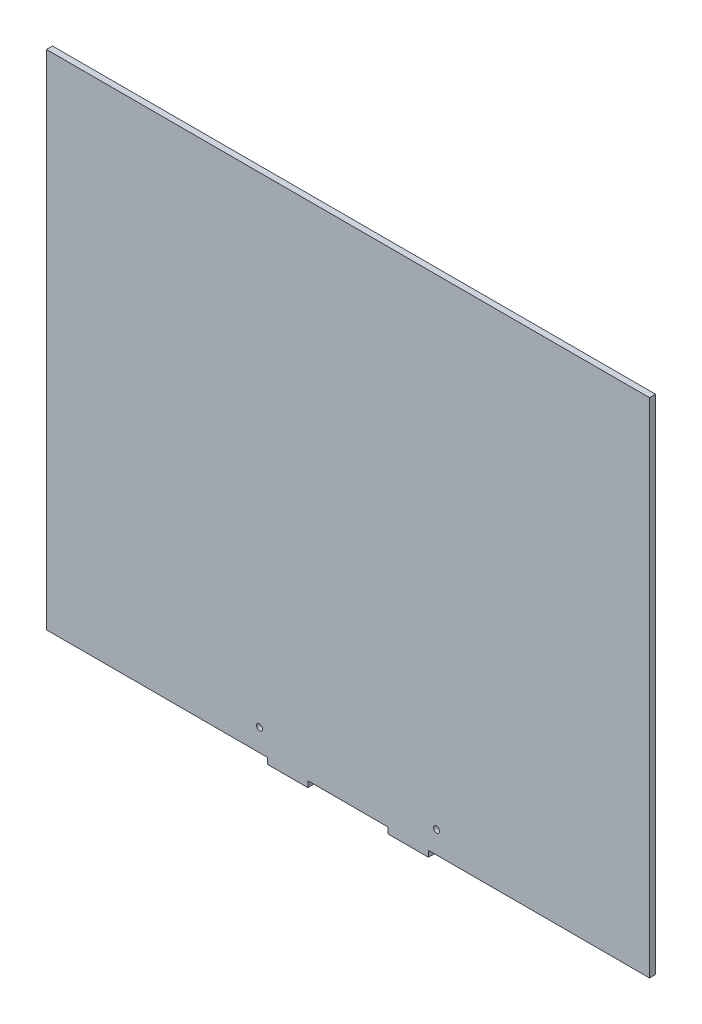
ISO-10303-21;
HEADER;
FILE_DESCRIPTION(('STEP AP214'),'2;1');
FILE_NAME('part.step','',(''),(''),'','','');
FILE_SCHEMA(('AUTOMOTIVE_DESIGN { 1 0 10303 214 1 1 1 1 }'));
ENDSEC;
DATA;
#1=APPLICATION_CONTEXT('core data for automotive mechanical design processes');
#2=APPLICATION_PROTOCOL_DEFINITION('international standard','automotive_design',2000,#1);
#3=PRODUCT_CONTEXT('',#1,'mechanical');
#4=PRODUCT('Part','Part','',(#3));
#5=PRODUCT_RELATED_PRODUCT_CATEGORY('part','',(#4));
#6=PRODUCT_DEFINITION_FORMATION('','',#4);
#7=PRODUCT_DEFINITION_CONTEXT('part definition',#1,'design');
#8=PRODUCT_DEFINITION('design','',#6,#7);
#9=PRODUCT_DEFINITION_SHAPE('','',#8);
#10=(LENGTH_UNIT() NAMED_UNIT(*) SI_UNIT(.MILLI.,.METRE.));
#11=(NAMED_UNIT(*) PLANE_ANGLE_UNIT() SI_UNIT($,.RADIAN.));
#12=(NAMED_UNIT(*) SI_UNIT($,.STERADIAN.) SOLID_ANGLE_UNIT());
#13=UNCERTAINTY_MEASURE_WITH_UNIT(LENGTH_MEASURE(1.E-05),#10,'distance_accuracy_value','');
#14=(GEOMETRIC_REPRESENTATION_CONTEXT(3) GLOBAL_UNCERTAINTY_ASSIGNED_CONTEXT((#13)) GLOBAL_UNIT_ASSIGNED_CONTEXT((#10,
#11,#12)) REPRESENTATION_CONTEXT('',''));
#15=CARTESIAN_POINT('',(0.,0.,0.));
#16=DIRECTION('',(0.,0.,1.));
#17=DIRECTION('',(1.,0.,0.));
#18=AXIS2_PLACEMENT_3D('',#15,#16,#17);
#19=CARTESIAN_POINT('',(-182.836591611344,142.129118457328,3.));
#20=DIRECTION('',(0.,1.,0.));
#21=DIRECTION('',(-1.,0.,0.));
#22=AXIS2_PLACEMENT_3D('',#19,#20,#21);
#23=PLANE('',#22);
#24=DIRECTION('',(1.,0.,0.));
#25=VECTOR('',#24,1.);
#26=CARTESIAN_POINT('',(-182.836591611344,142.129118457328,0.));
#27=LINE('',#26,#25);
#28=CARTESIAN_POINT('',(-182.836591611344,142.129118457328,0.));
#29=VERTEX_POINT('',#28);
#30=CARTESIAN_POINT('',(117.163408388656,142.129118457328,0.));
#31=VERTEX_POINT('',#30);
#32=EDGE_CURVE('E155',#29,#31,#27,.T.);
#33=ORIENTED_EDGE('',*,*,#32,.F.);
#34=DIRECTION('',(0.,0.,-1.));
#35=VECTOR('',#34,1.);
#36=CARTESIAN_POINT('',(-182.836591611344,142.129118457328,3.));
#37=LINE('',#36,#35);
#38=CARTESIAN_POINT('',(-182.836591611344,142.129118457328,3.));
#39=VERTEX_POINT('',#38);
#40=EDGE_CURVE('E11',#39,#29,#37,.T.);
#41=ORIENTED_EDGE('',*,*,#40,.F.);
#42=DIRECTION('',(1.,0.,0.));
#43=VECTOR('',#42,1.);
#44=CARTESIAN_POINT('',(-182.836591611344,142.129118457328,3.));
#45=LINE('',#44,#43);
#46=CARTESIAN_POINT('',(117.163408388656,142.129118457328,3.));
#47=VERTEX_POINT('',#46);
#48=EDGE_CURVE('E180',#39,#47,#45,.T.);
#49=ORIENTED_EDGE('',*,*,#48,.T.);
#50=DIRECTION('',(0.,0.,-1.));
#51=VECTOR('',#50,1.);
#52=CARTESIAN_POINT('',(117.163408388656,142.129118457328,3.));
#53=LINE('',#52,#51);
#54=EDGE_CURVE('E36',#47,#31,#53,.T.);
#55=ORIENTED_EDGE('',*,*,#54,.T.);
#56=EDGE_LOOP('',(#33,#41,#49,#55));
#57=FACE_BOUND('',#56,.T.);
#58=ADVANCED_FACE('F33',(#57),#23,.T.);
#59=CARTESIAN_POINT('',(-182.836591611344,142.129118457328,3.));
#60=DIRECTION('',(1.,0.,0.));
#61=DIRECTION('',(0.,1.,0.));
#62=AXIS2_PLACEMENT_3D('',#59,#60,#61);
#63=PLANE('',#62);
#64=DIRECTION('',(0.,-1.,0.));
#65=VECTOR('',#64,1.);
#66=CARTESIAN_POINT('',(-182.836591611344,142.129118457328,0.));
#67=LINE('',#66,#65);
#68=CARTESIAN_POINT('',(-182.836591611344,-107.870881542672,0.));
#69=VERTEX_POINT('',#68);
#70=EDGE_CURVE('E90',#29,#69,#67,.T.);
#71=ORIENTED_EDGE('',*,*,#70,.T.);
#72=DIRECTION('',(0.,0.,-1.));
#73=VECTOR('',#72,1.);
#74=CARTESIAN_POINT('',(-182.836591611344,-107.870881542672,3.));
#75=LINE('',#74,#73);
#76=CARTESIAN_POINT('',(-182.836591611344,-107.870881542672,3.));
#77=VERTEX_POINT('',#76);
#78=EDGE_CURVE('E42',#77,#69,#75,.T.);
#79=ORIENTED_EDGE('',*,*,#78,.F.);
#80=DIRECTION('',(0.,-1.,0.));
#81=VECTOR('',#80,1.);
#82=CARTESIAN_POINT('',(-182.836591611344,142.129118457328,3.));
#83=LINE('',#82,#81);
#84=EDGE_CURVE('E133',#39,#77,#83,.T.);
#85=ORIENTED_EDGE('',*,*,#84,.F.);
#86=ORIENTED_EDGE('',*,*,#40,.T.);
#87=EDGE_LOOP('',(#71,#79,#85,#86));
#88=FACE_BOUND('',#87,.T.);
#89=ADVANCED_FACE('F270',(#88),#63,.F.);
#90=CARTESIAN_POINT('',(-182.836591611344,-107.870881542672,3.));
#91=DIRECTION('',(0.,1.,0.));
#92=DIRECTION('',(0.,0.,1.));
#93=AXIS2_PLACEMENT_3D('',#90,#91,#92);
#94=PLANE('',#93);
#95=DIRECTION('',(1.,0.,0.));
#96=VECTOR('',#95,1.);
#97=CARTESIAN_POINT('',(-182.836591611344,-107.870881542672,0.));
#98=LINE('',#97,#96);
#99=CARTESIAN_POINT('',(-72.8365916113441,-107.870881542672,0.));
#100=VERTEX_POINT('',#99);
#101=EDGE_CURVE('E140',#69,#100,#98,.T.);
#102=ORIENTED_EDGE('',*,*,#101,.T.);
#103=DIRECTION('',(0.,0.,-1.));
#104=VECTOR('',#103,1.);
#105=CARTESIAN_POINT('',(-72.8365916113441,-107.870881542672,3.));
#106=LINE('',#105,#104);
#107=CARTESIAN_POINT('',(-72.8365916113441,-107.870881542672,3.));
#108=VERTEX_POINT('',#107);
#109=EDGE_CURVE('E137',#108,#100,#106,.T.);
#110=ORIENTED_EDGE('',*,*,#109,.F.);
#111=DIRECTION('',(1.,0.,0.));
#112=VECTOR('',#111,1.);
#113=CARTESIAN_POINT('',(-182.836591611344,-107.870881542672,3.));
#114=LINE('',#113,#112);
#115=EDGE_CURVE('E126',#77,#108,#114,.T.);
#116=ORIENTED_EDGE('',*,*,#115,.F.);
#117=ORIENTED_EDGE('',*,*,#78,.T.);
#118=EDGE_LOOP('',(#102,#110,#116,#117));
#119=FACE_BOUND('',#118,.T.);
#120=ADVANCED_FACE('F138',(#119),#94,.F.);
#121=CARTESIAN_POINT('',(-72.8365916113441,-107.870881542672,3.));
#122=DIRECTION('',(1.,0.,0.));
#123=DIRECTION('',(0.,0.,-1.));
#124=AXIS2_PLACEMENT_3D('',#121,#122,#123);
#125=PLANE('',#124);
#126=DIRECTION('',(0.,-1.,0.));
#127=VECTOR('',#126,1.);
#128=CARTESIAN_POINT('',(-72.8365916113441,-107.870881542672,0.));
#129=LINE('',#128,#127);
#130=CARTESIAN_POINT('',(-72.8365916113441,-110.870881542672,0.));
#131=VERTEX_POINT('',#130);
#132=EDGE_CURVE('E177',#100,#131,#129,.T.);
#133=ORIENTED_EDGE('',*,*,#132,.T.);
#134=DIRECTION('',(0.,0.,-1.));
#135=VECTOR('',#134,1.);
#136=CARTESIAN_POINT('',(-72.8365916113441,-110.870881542672,3.));
#137=LINE('',#136,#135);
#138=CARTESIAN_POINT('',(-72.8365916113441,-110.870881542672,3.));
#139=VERTEX_POINT('',#138);
#140=EDGE_CURVE('E143',#139,#131,#137,.T.);
#141=ORIENTED_EDGE('',*,*,#140,.F.);
#142=DIRECTION('',(0.,-1.,0.));
#143=VECTOR('',#142,1.);
#144=CARTESIAN_POINT('',(-72.8365916113441,-107.870881542672,3.));
#145=LINE('',#144,#143);
#146=EDGE_CURVE('E131',#108,#139,#145,.T.);
#147=ORIENTED_EDGE('',*,*,#146,.F.);
#148=ORIENTED_EDGE('',*,*,#109,.T.);
#149=EDGE_LOOP('',(#133,#141,#147,#148));
#150=FACE_BOUND('',#149,.T.);
#151=ADVANCED_FACE('F145',(#150),#125,.F.);
#152=CARTESIAN_POINT('',(-72.8365916113441,-110.870881542672,3.));
#153=DIRECTION('',(0.,1.,0.));
#154=DIRECTION('',(0.,0.,1.));
#155=AXIS2_PLACEMENT_3D('',#152,#153,#154);
#156=PLANE('',#155);
#157=DIRECTION('',(1.,0.,0.));
#158=VECTOR('',#157,1.);
#159=CARTESIAN_POINT('',(-72.8365916113441,-110.870881542672,0.));
#160=LINE('',#159,#158);
#161=CARTESIAN_POINT('',(-52.8365916113441,-110.870881542672,0.));
#162=VERTEX_POINT('',#161);
#163=EDGE_CURVE('E175',#131,#162,#160,.T.);
#164=ORIENTED_EDGE('',*,*,#163,.T.);
#165=DIRECTION('',(0.,0.,-1.));
#166=VECTOR('',#165,1.);
#167=CARTESIAN_POINT('',(-52.8365916113441,-110.870881542672,3.));
#168=LINE('',#167,#166);
#169=CARTESIAN_POINT('',(-52.8365916113441,-110.870881542672,3.));
#170=VERTEX_POINT('',#169);
#171=EDGE_CURVE('E184',#170,#162,#168,.T.);
#172=ORIENTED_EDGE('',*,*,#171,.F.);
#173=DIRECTION('',(1.,0.,0.));
#174=VECTOR('',#173,1.);
#175=CARTESIAN_POINT('',(-72.8365916113441,-110.870881542672,3.));
#176=LINE('',#175,#174);
#177=EDGE_CURVE('E148',#139,#170,#176,.T.);
#178=ORIENTED_EDGE('',*,*,#177,.F.);
#179=ORIENTED_EDGE('',*,*,#140,.T.);
#180=EDGE_LOOP('',(#164,#172,#178,#179));
#181=FACE_BOUND('',#180,.T.);
#182=ADVANCED_FACE('F210',(#181),#156,.F.);
#183=CARTESIAN_POINT('',(-52.8365916113441,-110.870881542672,3.));
#184=DIRECTION('',(-1.,0.,0.));
#185=DIRECTION('',(0.,0.,1.));
#186=AXIS2_PLACEMENT_3D('',#183,#184,#185);
#187=PLANE('',#186);
#188=DIRECTION('',(0.,1.,0.));
#189=VECTOR('',#188,1.);
#190=CARTESIAN_POINT('',(-52.8365916113441,-110.870881542672,0.));
#191=LINE('',#190,#189);
#192=CARTESIAN_POINT('',(-52.8365916113441,-107.870881542672,0.));
#193=VERTEX_POINT('',#192);
#194=EDGE_CURVE('E173',#162,#193,#191,.T.);
#195=ORIENTED_EDGE('',*,*,#194,.T.);
#196=DIRECTION('',(0.,0.,-1.));
#197=VECTOR('',#196,1.);
#198=CARTESIAN_POINT('',(-52.8365916113441,-107.870881542672,3.));
#199=LINE('',#198,#197);
#200=CARTESIAN_POINT('',(-52.8365916113441,-107.870881542672,3.));
#201=VERTEX_POINT('',#200);
#202=EDGE_CURVE('E187',#201,#193,#199,.T.);
#203=ORIENTED_EDGE('',*,*,#202,.F.);
#204=DIRECTION('',(0.,1.,0.));
#205=VECTOR('',#204,1.);
#206=CARTESIAN_POINT('',(-52.8365916113441,-110.870881542672,3.));
#207=LINE('',#206,#205);
#208=EDGE_CURVE('E150',#170,#201,#207,.T.);
#209=ORIENTED_EDGE('',*,*,#208,.F.);
#210=ORIENTED_EDGE('',*,*,#171,.T.);
#211=EDGE_LOOP('',(#195,#203,#209,#210));
#212=FACE_BOUND('',#211,.T.);
#213=ADVANCED_FACE('F218',(#212),#187,.F.);
#214=CARTESIAN_POINT('',(-52.8365916113441,-107.870881542672,3.));
#215=DIRECTION('',(0.,1.,0.));
#216=DIRECTION('',(0.,0.,1.));
#217=AXIS2_PLACEMENT_3D('',#214,#215,#216);
#218=PLANE('',#217);
#219=DIRECTION('',(1.,0.,0.));
#220=VECTOR('',#219,1.);
#221=CARTESIAN_POINT('',(-52.8365916113441,-107.870881542672,0.));
#222=LINE('',#221,#220);
#223=CARTESIAN_POINT('',(-12.8365916113441,-107.870881542672,0.));
#224=VERTEX_POINT('',#223);
#225=EDGE_CURVE('E171',#193,#224,#222,.T.);
#226=ORIENTED_EDGE('',*,*,#225,.T.);
#227=DIRECTION('',(0.,0.,-1.));
#228=VECTOR('',#227,1.);
#229=CARTESIAN_POINT('',(-12.8365916113441,-107.870881542672,3.));
#230=LINE('',#229,#228);
#231=CARTESIAN_POINT('',(-12.8365916113441,-107.870881542672,3.));
#232=VERTEX_POINT('',#231);
#233=EDGE_CURVE('E190',#232,#224,#230,.T.);
#234=ORIENTED_EDGE('',*,*,#233,.F.);
#235=DIRECTION('',(1.,0.,0.));
#236=VECTOR('',#235,1.);
#237=CARTESIAN_POINT('',(-52.8365916113441,-107.870881542672,3.));
#238=LINE('',#237,#236);
#239=EDGE_CURVE('E215',#201,#232,#238,.T.);
#240=ORIENTED_EDGE('',*,*,#239,.F.);
#241=ORIENTED_EDGE('',*,*,#202,.T.);
#242=EDGE_LOOP('',(#226,#234,#240,#241));
#243=FACE_BOUND('',#242,.T.);
#244=ADVANCED_FACE('F221',(#243),#218,.F.);
#245=CARTESIAN_POINT('',(-12.8365916113441,-107.870881542672,3.));
#246=DIRECTION('',(1.,0.,0.));
#247=DIRECTION('',(0.,0.,-1.));
#248=AXIS2_PLACEMENT_3D('',#245,#246,#247);
#249=PLANE('',#248);
#250=DIRECTION('',(0.,-1.,0.));
#251=VECTOR('',#250,1.);
#252=CARTESIAN_POINT('',(-12.8365916113441,-107.870881542672,0.));
#253=LINE('',#252,#251);
#254=CARTESIAN_POINT('',(-12.8365916113441,-110.870881542672,0.));
#255=VERTEX_POINT('',#254);
#256=EDGE_CURVE('E169',#224,#255,#253,.T.);
#257=ORIENTED_EDGE('',*,*,#256,.T.);
#258=DIRECTION('',(0.,0.,-1.));
#259=VECTOR('',#258,1.);
#260=CARTESIAN_POINT('',(-12.8365916113441,-110.870881542672,3.));
#261=LINE('',#260,#259);
#262=CARTESIAN_POINT('',(-12.8365916113441,-110.870881542672,3.));
#263=VERTEX_POINT('',#262);
#264=EDGE_CURVE('E193',#263,#255,#261,.T.);
#265=ORIENTED_EDGE('',*,*,#264,.F.);
#266=DIRECTION('',(0.,-1.,0.));
#267=VECTOR('',#266,1.);
#268=CARTESIAN_POINT('',(-12.8365916113441,-107.870881542672,3.));
#269=LINE('',#268,#267);
#270=EDGE_CURVE('E223',#232,#263,#269,.T.);
#271=ORIENTED_EDGE('',*,*,#270,.F.);
#272=ORIENTED_EDGE('',*,*,#233,.T.);
#273=EDGE_LOOP('',(#257,#265,#271,#272));
#274=FACE_BOUND('',#273,.T.);
#275=ADVANCED_FACE('F288',(#274),#249,.F.);
#276=CARTESIAN_POINT('',(-12.8365916113441,-110.870881542672,3.));
#277=DIRECTION('',(0.,1.,0.));
#278=DIRECTION('',(0.,0.,1.));
#279=AXIS2_PLACEMENT_3D('',#276,#277,#278);
#280=PLANE('',#279);
#281=DIRECTION('',(1.,0.,0.));
#282=VECTOR('',#281,1.);
#283=CARTESIAN_POINT('',(-12.8365916113441,-110.870881542672,0.));
#284=LINE('',#283,#282);
#285=CARTESIAN_POINT('',(7.16340838865591,-110.870881542672,0.));
#286=VERTEX_POINT('',#285);
#287=EDGE_CURVE('E167',#255,#286,#284,.T.);
#288=ORIENTED_EDGE('',*,*,#287,.T.);
#289=DIRECTION('',(0.,0.,-1.));
#290=VECTOR('',#289,1.);
#291=CARTESIAN_POINT('',(7.16340838865591,-110.870881542672,3.));
#292=LINE('',#291,#290);
#293=CARTESIAN_POINT('',(7.16340838865591,-110.870881542672,3.));
#294=VERTEX_POINT('',#293);
#295=EDGE_CURVE('E196',#294,#286,#292,.T.);
#296=ORIENTED_EDGE('',*,*,#295,.F.);
#297=DIRECTION('',(1.,0.,0.));
#298=VECTOR('',#297,1.);
#299=CARTESIAN_POINT('',(-12.8365916113441,-110.870881542672,3.));
#300=LINE('',#299,#298);
#301=EDGE_CURVE('E225',#263,#294,#300,.T.);
#302=ORIENTED_EDGE('',*,*,#301,.F.);
#303=ORIENTED_EDGE('',*,*,#264,.T.);
#304=EDGE_LOOP('',(#288,#296,#302,#303));
#305=FACE_BOUND('',#304,.T.);
#306=ADVANCED_FACE('F291',(#305),#280,.F.);
#307=CARTESIAN_POINT('',(7.16340838865591,-110.870881542672,3.));
#308=DIRECTION('',(-1.,0.,0.));
#309=DIRECTION('',(0.,-1.,0.));
#310=AXIS2_PLACEMENT_3D('',#307,#308,#309);
#311=PLANE('',#310);
#312=DIRECTION('',(0.,1.,0.));
#313=VECTOR('',#312,1.);
#314=CARTESIAN_POINT('',(7.16340838865591,-110.870881542672,0.));
#315=LINE('',#314,#313);
#316=CARTESIAN_POINT('',(7.16340838865591,-107.870881542672,0.));
#317=VERTEX_POINT('',#316);
#318=EDGE_CURVE('E165',#286,#317,#315,.T.);
#319=ORIENTED_EDGE('',*,*,#318,.T.);
#320=DIRECTION('',(0.,0.,-1.));
#321=VECTOR('',#320,1.);
#322=CARTESIAN_POINT('',(7.16340838865591,-107.870881542672,3.));
#323=LINE('',#322,#321);
#324=CARTESIAN_POINT('',(7.16340838865591,-107.870881542672,3.));
#325=VERTEX_POINT('',#324);
#326=EDGE_CURVE('E199',#325,#317,#323,.T.);
#327=ORIENTED_EDGE('',*,*,#326,.F.);
#328=DIRECTION('',(0.,1.,0.));
#329=VECTOR('',#328,1.);
#330=CARTESIAN_POINT('',(7.16340838865591,-110.870881542672,3.));
#331=LINE('',#330,#329);
#332=EDGE_CURVE('E229',#294,#325,#331,.T.);
#333=ORIENTED_EDGE('',*,*,#332,.F.);
#334=ORIENTED_EDGE('',*,*,#295,.T.);
#335=EDGE_LOOP('',(#319,#327,#333,#334));
#336=FACE_BOUND('',#335,.T.);
#337=ADVANCED_FACE('F295',(#336),#311,.F.);
#338=CARTESIAN_POINT('',(7.16340838865591,-107.870881542672,3.));
#339=DIRECTION('',(0.,1.,0.));
#340=DIRECTION('',(0.,0.,1.));
#341=AXIS2_PLACEMENT_3D('',#338,#339,#340);
#342=PLANE('',#341);
#343=DIRECTION('',(1.,0.,0.));
#344=VECTOR('',#343,1.);
#345=CARTESIAN_POINT('',(7.16340838865591,-107.870881542672,0.));
#346=LINE('',#345,#344);
#347=CARTESIAN_POINT('',(117.163408388656,-107.870881542672,0.));
#348=VERTEX_POINT('',#347);
#349=EDGE_CURVE('E162',#317,#348,#346,.T.);
#350=ORIENTED_EDGE('',*,*,#349,.T.);
#351=DIRECTION('',(0.,0.,-1.));
#352=VECTOR('',#351,1.);
#353=CARTESIAN_POINT('',(117.163408388656,-107.870881542672,3.));
#354=LINE('',#353,#352);
#355=CARTESIAN_POINT('',(117.163408388656,-107.870881542672,3.));
#356=VERTEX_POINT('',#355);
#357=EDGE_CURVE('E201',#356,#348,#354,.T.);
#358=ORIENTED_EDGE('',*,*,#357,.F.);
#359=DIRECTION('',(1.,0.,0.));
#360=VECTOR('',#359,1.);
#361=CARTESIAN_POINT('',(7.16340838865591,-107.870881542672,3.));
#362=LINE('',#361,#360);
#363=EDGE_CURVE('E231',#325,#356,#362,.T.);
#364=ORIENTED_EDGE('',*,*,#363,.F.);
#365=ORIENTED_EDGE('',*,*,#326,.T.);
#366=EDGE_LOOP('',(#350,#358,#364,#365));
#367=FACE_BOUND('',#366,.T.);
#368=ADVANCED_FACE('F299',(#367),#342,.F.);
#369=CARTESIAN_POINT('',(117.163408388656,142.129118457328,3.));
#370=DIRECTION('',(1.,0.,0.));
#371=DIRECTION('',(0.,1.,0.));
#372=AXIS2_PLACEMENT_3D('',#369,#370,#371);
#373=PLANE('',#372);
#374=DIRECTION('',(0.,-1.,0.));
#375=VECTOR('',#374,1.);
#376=CARTESIAN_POINT('',(117.163408388656,142.129118457328,0.));
#377=LINE('',#376,#375);
#378=EDGE_CURVE('E158',#31,#348,#377,.T.);
#379=ORIENTED_EDGE('',*,*,#378,.F.);
#380=ORIENTED_EDGE('',*,*,#54,.F.);
#381=DIRECTION('',(0.,-1.,0.));
#382=VECTOR('',#381,1.);
#383=CARTESIAN_POINT('',(117.163408388656,142.129118457328,3.));
#384=LINE('',#383,#382);
#385=EDGE_CURVE('E233',#47,#356,#384,.T.);
#386=ORIENTED_EDGE('',*,*,#385,.T.);
#387=ORIENTED_EDGE('',*,*,#357,.T.);
#388=EDGE_LOOP('',(#379,#380,#386,#387));
#389=FACE_BOUND('',#388,.T.);
#390=ADVANCED_FACE('F203',(#389),#373,.T.);
#391=CARTESIAN_POINT('',(0.,0.,3.));
#392=DIRECTION('',(0.,0.,-1.));
#393=DIRECTION('',(-1.,0.,0.));
#394=AXIS2_PLACEMENT_3D('',#391,#392,#393);
#395=PLANE('',#394);
#396=CARTESIAN_POINT('',(-76.8365916113441,-96.8708815426724,3.));
#397=DIRECTION('',(0.,0.,-1.));
#398=DIRECTION('',(-1.,0.,0.));
#399=AXIS2_PLACEMENT_3D('',#396,#397,#398);
#400=CIRCLE('',#399,1.5);
#401=CARTESIAN_POINT('',(-78.3365916113441,-96.8708815426724,3.));
#402=VERTEX_POINT('',#401);
#403=EDGE_CURVE('E239',#402,#402,#400,.T.);
#404=ORIENTED_EDGE('',*,*,#403,.T.);
#405=EDGE_LOOP('',(#404));
#406=FACE_BOUND('',#405,.T.);
#407=CARTESIAN_POINT('',(11.1634083886559,-96.8708815426724,3.));
#408=DIRECTION('',(0.,0.,-1.));
#409=DIRECTION('',(-1.,0.,0.));
#410=AXIS2_PLACEMENT_3D('',#407,#408,#409);
#411=CIRCLE('',#410,1.5);
#412=CARTESIAN_POINT('',(9.66340838865588,-96.8708815426724,3.));
#413=VERTEX_POINT('',#412);
#414=EDGE_CURVE('E159',#413,#413,#411,.T.);
#415=ORIENTED_EDGE('',*,*,#414,.T.);
#416=EDGE_LOOP('',(#415));
#417=FACE_BOUND('',#416,.T.);
#418=ORIENTED_EDGE('',*,*,#48,.F.);
#419=ORIENTED_EDGE('',*,*,#84,.T.);
#420=ORIENTED_EDGE('',*,*,#115,.T.);
#421=ORIENTED_EDGE('',*,*,#146,.T.);
#422=ORIENTED_EDGE('',*,*,#177,.T.);
#423=ORIENTED_EDGE('',*,*,#208,.T.);
#424=ORIENTED_EDGE('',*,*,#239,.T.);
#425=ORIENTED_EDGE('',*,*,#270,.T.);
#426=ORIENTED_EDGE('',*,*,#301,.T.);
#427=ORIENTED_EDGE('',*,*,#332,.T.);
#428=ORIENTED_EDGE('',*,*,#363,.T.);
#429=ORIENTED_EDGE('',*,*,#385,.F.);
#430=EDGE_LOOP('',(#418,#419,#420,#421,#422,#423,#424,#425,#426,#427,#428,#429));
#431=FACE_BOUND('',#430,.T.);
#432=ADVANCED_FACE('F129',(#406,#417,#431),#395,.F.);
#433=CARTESIAN_POINT('',(0.,0.,0.));
#434=DIRECTION('',(0.,0.,-1.));
#435=DIRECTION('',(-1.,0.,0.));
#436=AXIS2_PLACEMENT_3D('',#433,#434,#435);
#437=PLANE('',#436);
#438=CARTESIAN_POINT('',(-76.8365916113441,-96.8708815426724,0.));
#439=DIRECTION('',(0.,0.,-1.));
#440=DIRECTION('',(-1.,0.,0.));
#441=AXIS2_PLACEMENT_3D('',#438,#439,#440);
#442=CIRCLE('',#441,1.5);
#443=CARTESIAN_POINT('',(-78.3365916113441,-96.8708815426724,0.));
#444=VERTEX_POINT('',#443);
#445=EDGE_CURVE('E242',#444,#444,#442,.T.);
#446=ORIENTED_EDGE('',*,*,#445,.F.);
#447=EDGE_LOOP('',(#446));
#448=FACE_BOUND('',#447,.T.);
#449=CARTESIAN_POINT('',(11.1634083886559,-96.8708815426724,0.));
#450=DIRECTION('',(0.,0.,-1.));
#451=DIRECTION('',(-1.,0.,0.));
#452=AXIS2_PLACEMENT_3D('',#449,#450,#451);
#453=CIRCLE('',#452,1.5);
#454=CARTESIAN_POINT('',(9.66340838865588,-96.8708815426724,0.));
#455=VERTEX_POINT('',#454);
#456=EDGE_CURVE('E236',#455,#455,#453,.T.);
#457=ORIENTED_EDGE('',*,*,#456,.F.);
#458=EDGE_LOOP('',(#457));
#459=FACE_BOUND('',#458,.T.);
#460=ORIENTED_EDGE('',*,*,#32,.T.);
#461=ORIENTED_EDGE('',*,*,#378,.T.);
#462=ORIENTED_EDGE('',*,*,#349,.F.);
#463=ORIENTED_EDGE('',*,*,#318,.F.);
#464=ORIENTED_EDGE('',*,*,#287,.F.);
#465=ORIENTED_EDGE('',*,*,#256,.F.);
#466=ORIENTED_EDGE('',*,*,#225,.F.);
#467=ORIENTED_EDGE('',*,*,#194,.F.);
#468=ORIENTED_EDGE('',*,*,#163,.F.);
#469=ORIENTED_EDGE('',*,*,#132,.F.);
#470=ORIENTED_EDGE('',*,*,#101,.F.);
#471=ORIENTED_EDGE('',*,*,#70,.F.);
#472=EDGE_LOOP('',(#460,#461,#462,#463,#464,#465,#466,#467,#468,#469,#470,#471));
#473=FACE_BOUND('',#472,.T.);
#474=ADVANCED_FACE('F206',(#448,#459,#473),#437,.T.);
#475=CARTESIAN_POINT('',(11.1634083886559,-96.8708815426724,3.));
#476=DIRECTION('',(0.,0.,-1.));
#477=DIRECTION('',(-1.,0.,0.));
#478=AXIS2_PLACEMENT_3D('',#475,#476,#477);
#479=CYLINDRICAL_SURFACE('',#478,1.5);
#480=ORIENTED_EDGE('',*,*,#414,.F.);
#481=EDGE_LOOP('',(#480));
#482=FACE_BOUND('',#481,.T.);
#483=ORIENTED_EDGE('',*,*,#456,.T.);
#484=EDGE_LOOP('',(#483));
#485=FACE_BOUND('',#484,.T.);
#486=ADVANCED_FACE('F253',(#482,#485),#479,.F.);
#487=CARTESIAN_POINT('',(-76.8365916113441,-96.8708815426724,3.));
#488=DIRECTION('',(0.,0.,-1.));
#489=DIRECTION('',(-1.,0.,0.));
#490=AXIS2_PLACEMENT_3D('',#487,#488,#489);
#491=CYLINDRICAL_SURFACE('',#490,1.5);
#492=ORIENTED_EDGE('',*,*,#403,.F.);
#493=EDGE_LOOP('',(#492));
#494=FACE_BOUND('',#493,.T.);
#495=ORIENTED_EDGE('',*,*,#445,.T.);
#496=EDGE_LOOP('',(#495));
#497=FACE_BOUND('',#496,.T.);
#498=ADVANCED_FACE('F250',(#494,#497),#491,.F.);
#499=CLOSED_SHELL('',(#58,#89,#120,#151,#182,#213,#244,#275,#306,#337,#368,#390,#432,#474,#486,#498));
#500=MANIFOLD_SOLID_BREP('B2',#499);
#501=ADVANCED_BREP_SHAPE_REPRESENTATION('',(#18,#500),#14);
#502=SHAPE_DEFINITION_REPRESENTATION(#9,#501);
ENDSEC;
END-ISO-10303-21;
